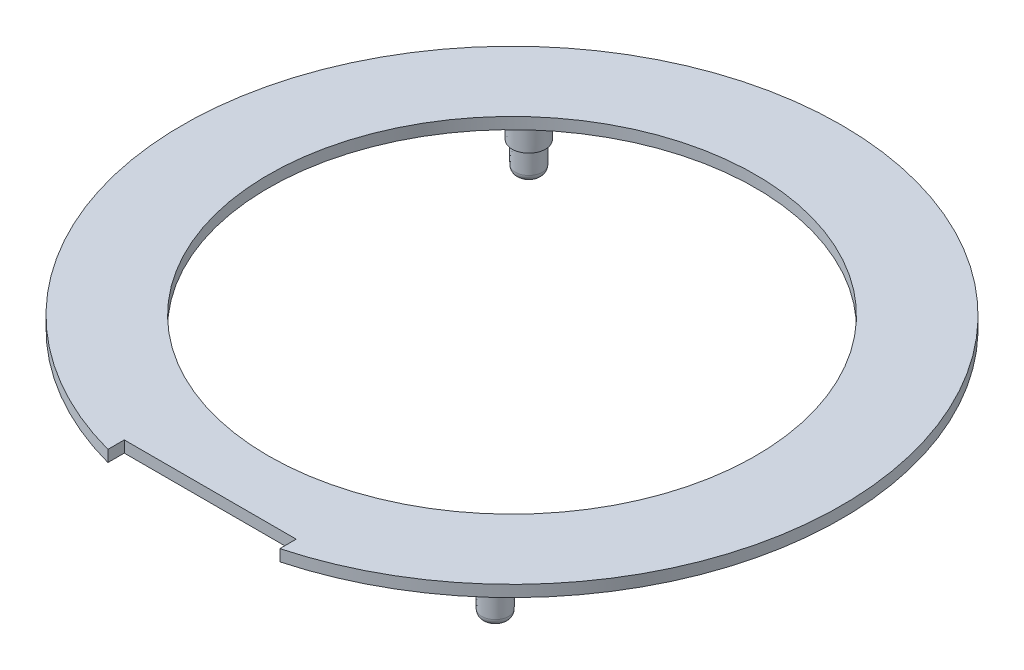
ISO-10303-21;
HEADER;
FILE_DESCRIPTION(('STEP AP214'),'2;1');
FILE_NAME('part.step','',(''),(''),'','','');
FILE_SCHEMA(('AUTOMOTIVE_DESIGN { 1 0 10303 214 1 1 1 1 }'));
ENDSEC;
DATA;
#1=APPLICATION_CONTEXT('core data for automotive mechanical design processes');
#2=APPLICATION_PROTOCOL_DEFINITION('international standard','automotive_design',2000,#1);
#3=PRODUCT_CONTEXT('',#1,'mechanical');
#4=PRODUCT('Part','Part','',(#3));
#5=PRODUCT_RELATED_PRODUCT_CATEGORY('part','',(#4));
#6=PRODUCT_DEFINITION_FORMATION('','',#4);
#7=PRODUCT_DEFINITION_CONTEXT('part definition',#1,'design');
#8=PRODUCT_DEFINITION('design','',#6,#7);
#9=PRODUCT_DEFINITION_SHAPE('','',#8);
#10=(LENGTH_UNIT() NAMED_UNIT(*) SI_UNIT(.MILLI.,.METRE.));
#11=(NAMED_UNIT(*) PLANE_ANGLE_UNIT() SI_UNIT($,.RADIAN.));
#12=(NAMED_UNIT(*) SI_UNIT($,.STERADIAN.) SOLID_ANGLE_UNIT());
#13=UNCERTAINTY_MEASURE_WITH_UNIT(LENGTH_MEASURE(1.E-05),#10,'distance_accuracy_value','');
#14=(GEOMETRIC_REPRESENTATION_CONTEXT(3) GLOBAL_UNCERTAINTY_ASSIGNED_CONTEXT((#13)) GLOBAL_UNIT_ASSIGNED_CONTEXT((#10,
#11,#12)) REPRESENTATION_CONTEXT('',''));
#15=CARTESIAN_POINT('',(0.,0.,0.));
#16=DIRECTION('',(0.,0.,1.));
#17=DIRECTION('',(1.,0.,0.));
#18=AXIS2_PLACEMENT_3D('',#15,#16,#17);
#19=CARTESIAN_POINT('',(0.,0.4,-1.53064501));
#20=DIRECTION('',(0.,1.,0.));
#21=DIRECTION('',(0.,0.,1.));
#22=AXIS2_PLACEMENT_3D('',#19,#20,#21);
#23=PLANE('',#22);
#24=DIRECTION('',(0.,0.,1.));
#25=VECTOR('',#24,1.);
#26=CARTESIAN_POINT('',(-3.,0.4,9.));
#27=LINE('',#26,#25);
#28=CARTESIAN_POINT('',(-3.,0.4,9.));
#29=VERTEX_POINT('',#28);
#30=CARTESIAN_POINT('',(-3.,0.4,9.57115664558726));
#31=VERTEX_POINT('',#30);
#32=EDGE_CURVE('E85',#29,#31,#27,.T.);
#33=ORIENTED_EDGE('',*,*,#32,.F.);
#34=DIRECTION('',(-1.,0.,0.));
#35=VECTOR('',#34,1.);
#36=CARTESIAN_POINT('',(3.,0.4,9.));
#37=LINE('',#36,#35);
#38=CARTESIAN_POINT('',(3.,0.4,9.));
#39=VERTEX_POINT('',#38);
#40=EDGE_CURVE('E93',#39,#29,#37,.T.);
#41=ORIENTED_EDGE('',*,*,#40,.F.);
#42=DIRECTION('',(0.,0.,-1.));
#43=VECTOR('',#42,1.);
#44=CARTESIAN_POINT('',(3.,0.4,9.));
#45=LINE('',#44,#43);
#46=CARTESIAN_POINT('',(3.,0.4,9.57115664558726));
#47=VERTEX_POINT('',#46);
#48=EDGE_CURVE('E78',#47,#39,#45,.T.);
#49=ORIENTED_EDGE('',*,*,#48,.F.);
#50=CARTESIAN_POINT('',(0.,0.4,-1.53064501));
#51=DIRECTION('',(0.,1.,0.));
#52=DIRECTION('',(0.,0.,1.));
#53=AXIS2_PLACEMENT_3D('',#50,#51,#52);
#54=CIRCLE('',#53,11.5);
#55=EDGE_CURVE('E91',#47,#31,#54,.T.);
#56=ORIENTED_EDGE('',*,*,#55,.T.);
#57=EDGE_LOOP('',(#33,#41,#49,#56));
#58=FACE_BOUND('',#57,.T.);
#59=CARTESIAN_POINT('',(0.,0.4,-1.53064501));
#60=DIRECTION('',(0.,1.,0.));
#61=DIRECTION('',(0.,0.,1.));
#62=AXIS2_PLACEMENT_3D('',#59,#60,#61);
#63=CIRCLE('',#62,8.5);
#64=CARTESIAN_POINT('',(0.,0.4,6.96935499));
#65=VERTEX_POINT('',#64);
#66=EDGE_CURVE('E104',#65,#65,#63,.T.);
#67=ORIENTED_EDGE('',*,*,#66,.F.);
#68=EDGE_LOOP('',(#67));
#69=FACE_BOUND('',#68,.T.);
#70=ADVANCED_FACE('F35',(#58,#69),#23,.T.);
#71=CARTESIAN_POINT('',(0.,0.,-1.53064501));
#72=DIRECTION('',(0.,1.,0.));
#73=DIRECTION('',(0.,0.,1.));
#74=AXIS2_PLACEMENT_3D('',#71,#72,#73);
#75=PLANE('',#74);
#76=CARTESIAN_POINT('',(6.41810697234869,0.,5.47348968969626));
#77=DIRECTION('',(0.,1.,0.));
#78=DIRECTION('',(1.,0.,0.));
#79=AXIS2_PLACEMENT_3D('',#76,#77,#78);
#80=CIRCLE('',#79,0.6);
#81=CARTESIAN_POINT('',(7.01810697234869,0.,5.47348968969626));
#82=VERTEX_POINT('',#81);
#83=EDGE_CURVE('E113',#82,#82,#80,.T.);
#84=ORIENTED_EDGE('',*,*,#83,.T.);
#85=EDGE_LOOP('',(#84));
#86=FACE_BOUND('',#85,.T.);
#87=CARTESIAN_POINT('',(7.00413469969619,0.,-7.94875198234876));
#88=DIRECTION('',(0.,1.,0.));
#89=DIRECTION('',(0.,0.,-1.));
#90=AXIS2_PLACEMENT_3D('',#87,#88,#89);
#91=CIRCLE('',#90,0.6);
#92=CARTESIAN_POINT('',(7.00413469969619,0.,-8.54875198234876));
#93=VERTEX_POINT('',#92);
#94=EDGE_CURVE('E112',#93,#93,#91,.T.);
#95=ORIENTED_EDGE('',*,*,#94,.T.);
#96=EDGE_LOOP('',(#95));
#97=FACE_BOUND('',#96,.T.);
#98=CARTESIAN_POINT('',(-6.41810697234874,0.,-8.53477970969621));
#99=DIRECTION('',(0.,1.,0.));
#100=DIRECTION('',(-1.,0.,0.));
#101=AXIS2_PLACEMENT_3D('',#98,#99,#100);
#102=CIRCLE('',#101,0.6);
#103=CARTESIAN_POINT('',(-7.01810697234874,0.,-8.53477970969622));
#104=VERTEX_POINT('',#103);
#105=EDGE_CURVE('E125',#104,#104,#102,.T.);
#106=ORIENTED_EDGE('',*,*,#105,.T.);
#107=EDGE_LOOP('',(#106));
#108=FACE_BOUND('',#107,.T.);
#109=CARTESIAN_POINT('',(-7.00413469969619,0.,4.88746196234876));
#110=DIRECTION('',(0.,1.,0.));
#111=DIRECTION('',(0.,0.,1.));
#112=AXIS2_PLACEMENT_3D('',#109,#110,#111);
#113=CIRCLE('',#112,0.6);
#114=CARTESIAN_POINT('',(-7.00413469969619,0.,5.48746196234876));
#115=VERTEX_POINT('',#114);
#116=EDGE_CURVE('E118',#115,#115,#113,.T.);
#117=ORIENTED_EDGE('',*,*,#116,.T.);
#118=EDGE_LOOP('',(#117));
#119=FACE_BOUND('',#118,.T.);
#120=DIRECTION('',(1.,0.,0.));
#121=VECTOR('',#120,1.);
#122=CARTESIAN_POINT('',(3.,0.,9.));
#123=LINE('',#122,#121);
#124=CARTESIAN_POINT('',(-3.,0.,9.));
#125=VERTEX_POINT('',#124);
#126=CARTESIAN_POINT('',(3.,0.,9.));
#127=VERTEX_POINT('',#126);
#128=EDGE_CURVE('E421',#125,#127,#123,.T.);
#129=ORIENTED_EDGE('',*,*,#128,.F.);
#130=DIRECTION('',(0.,0.,-1.));
#131=VECTOR('',#130,1.);
#132=CARTESIAN_POINT('',(-3.,0.,9.));
#133=LINE('',#132,#131);
#134=CARTESIAN_POINT('',(-3.,0.,9.57115664558726));
#135=VERTEX_POINT('',#134);
#136=EDGE_CURVE('E59',#135,#125,#133,.T.);
#137=ORIENTED_EDGE('',*,*,#136,.F.);
#138=CARTESIAN_POINT('',(0.,0.,-1.53064501));
#139=DIRECTION('',(0.,1.,0.));
#140=DIRECTION('',(0.,0.,1.));
#141=AXIS2_PLACEMENT_3D('',#138,#139,#140);
#142=CIRCLE('',#141,11.5);
#143=CARTESIAN_POINT('',(3.,0.,9.57115664558726));
#144=VERTEX_POINT('',#143);
#145=EDGE_CURVE('E99',#144,#135,#142,.T.);
#146=ORIENTED_EDGE('',*,*,#145,.F.);
#147=DIRECTION('',(0.,0.,1.));
#148=VECTOR('',#147,1.);
#149=CARTESIAN_POINT('',(3.,0.,9.));
#150=LINE('',#149,#148);
#151=EDGE_CURVE('E50',#127,#144,#150,.T.);
#152=ORIENTED_EDGE('',*,*,#151,.F.);
#153=EDGE_LOOP('',(#129,#137,#146,#152));
#154=FACE_BOUND('',#153,.T.);
#155=CARTESIAN_POINT('',(0.,0.,-1.53064501));
#156=DIRECTION('',(0.,1.,0.));
#157=DIRECTION('',(0.,0.,1.));
#158=AXIS2_PLACEMENT_3D('',#155,#156,#157);
#159=CIRCLE('',#158,8.5);
#160=CARTESIAN_POINT('',(0.,0.,6.96935499));
#161=VERTEX_POINT('',#160);
#162=EDGE_CURVE('E107',#161,#161,#159,.T.);
#163=ORIENTED_EDGE('',*,*,#162,.T.);
#164=EDGE_LOOP('',(#163));
#165=FACE_BOUND('',#164,.T.);
#166=ADVANCED_FACE('F170',(#86,#97,#108,#119,#154,#165),#75,.F.);
#167=CARTESIAN_POINT('',(0.,0.4,-1.53064501));
#168=DIRECTION('',(0.,-1.,0.));
#169=DIRECTION('',(0.,0.,-1.));
#170=AXIS2_PLACEMENT_3D('',#167,#168,#169);
#171=CYLINDRICAL_SURFACE('',#170,11.5);
#172=ORIENTED_EDGE('',*,*,#145,.T.);
#173=DIRECTION('',(0.,1.,0.));
#174=VECTOR('',#173,1.);
#175=CARTESIAN_POINT('',(-3.,-6.07779969204628,9.57115664558726));
#176=LINE('',#175,#174);
#177=EDGE_CURVE('E97',#135,#31,#176,.T.);
#178=ORIENTED_EDGE('',*,*,#177,.T.);
#179=ORIENTED_EDGE('',*,*,#55,.F.);
#180=DIRECTION('',(0.,1.,0.));
#181=VECTOR('',#180,1.);
#182=CARTESIAN_POINT('',(3.,-6.07779969204628,9.57115664558726));
#183=LINE('',#182,#181);
#184=EDGE_CURVE('E75',#144,#47,#183,.T.);
#185=ORIENTED_EDGE('',*,*,#184,.F.);
#186=EDGE_LOOP('',(#172,#178,#179,#185));
#187=FACE_BOUND('',#186,.T.);
#188=ADVANCED_FACE('F96',(#187),#171,.T.);
#189=CARTESIAN_POINT('',(0.,0.4,-1.53064501));
#190=DIRECTION('',(0.,-1.,0.));
#191=DIRECTION('',(0.,0.,-1.));
#192=AXIS2_PLACEMENT_3D('',#189,#190,#191);
#193=CYLINDRICAL_SURFACE('',#192,8.5);
#194=ORIENTED_EDGE('',*,*,#66,.T.);
#195=EDGE_LOOP('',(#194));
#196=FACE_BOUND('',#195,.T.);
#197=ORIENTED_EDGE('',*,*,#162,.F.);
#198=EDGE_LOOP('',(#197));
#199=FACE_BOUND('',#198,.T.);
#200=ADVANCED_FACE('F178',(#196,#199),#193,.F.);
#201=CARTESIAN_POINT('',(-7.00413469969619,0.,4.88746196234876));
#202=DIRECTION('',(0.,1.,0.));
#203=DIRECTION('',(0.,0.,-1.));
#204=AXIS2_PLACEMENT_3D('',#201,#202,#203);
#205=CONICAL_SURFACE('',#204,0.6,0.0174532925199433);
#206=CARTESIAN_POINT('',(-7.00413469969619,-1.,4.88746196234876));
#207=DIRECTION('',(0.,1.,0.));
#208=DIRECTION('',(0.,0.,1.));
#209=AXIS2_PLACEMENT_3D('',#206,#207,#208);
#210=CIRCLE('',#209,0.582544935071783);
#211=CARTESIAN_POINT('',(-7.00413469969619,-1.,5.47000689742054));
#212=VERTEX_POINT('',#211);
#213=EDGE_CURVE('E115',#212,#212,#210,.T.);
#214=ORIENTED_EDGE('',*,*,#213,.T.);
#215=EDGE_LOOP('',(#214));
#216=FACE_BOUND('',#215,.T.);
#217=ORIENTED_EDGE('',*,*,#116,.F.);
#218=EDGE_LOOP('',(#217));
#219=FACE_BOUND('',#218,.T.);
#220=ADVANCED_FACE('F213',(#216,#219),#205,.T.);
#221=CARTESIAN_POINT('',(-7.00413469969619,-1.,4.88746196234876));
#222=DIRECTION('',(0.,1.,0.));
#223=DIRECTION('',(0.,0.,1.));
#224=AXIS2_PLACEMENT_3D('',#221,#222,#223);
#225=PLANE('',#224);
#226=CARTESIAN_POINT('',(-7.00413469969619,-1.,4.88746196234876));
#227=DIRECTION('',(0.,1.,0.));
#228=DIRECTION('',(0.,0.,1.));
#229=AXIS2_PLACEMENT_3D('',#226,#227,#228);
#230=CIRCLE('',#229,0.482544935071784);
#231=CARTESIAN_POINT('',(-7.00413469969619,-1.,5.37000689742055));
#232=VERTEX_POINT('',#231);
#233=EDGE_CURVE('E98',#232,#232,#230,.F.);
#234=ORIENTED_EDGE('',*,*,#233,.F.);
#235=EDGE_LOOP('',(#234));
#236=FACE_BOUND('',#235,.T.);
#237=ORIENTED_EDGE('',*,*,#213,.F.);
#238=EDGE_LOOP('',(#237));
#239=FACE_BOUND('',#238,.T.);
#240=ADVANCED_FACE('F216',(#236,#239),#225,.F.);
#241=CARTESIAN_POINT('',(-7.00413469969619,0.,4.88746196234876));
#242=DIRECTION('',(0.,1.,0.));
#243=DIRECTION('',(0.,0.,-1.));
#244=AXIS2_PLACEMENT_3D('',#241,#242,#243);
#245=CONICAL_SURFACE('',#244,0.500000000000002,0.0174532925199433);
#246=CARTESIAN_POINT('',(-7.00413469969619,-1.75436310160932,4.88746196234876));
#247=DIRECTION('',(0.,1.,0.));
#248=DIRECTION('',(0.,0.,1.));
#249=AXIS2_PLACEMENT_3D('',#246,#247,#248);
#250=CIRCLE('',#249,0.469377478153742);
#251=CARTESIAN_POINT('',(-7.00413469969619,-1.75436310160932,5.3568394405025));
#252=VERTEX_POINT('',#251);
#253=EDGE_CURVE('E137',#252,#252,#250,.T.);
#254=ORIENTED_EDGE('',*,*,#253,.T.);
#255=EDGE_LOOP('',(#254));
#256=FACE_BOUND('',#255,.T.);
#257=ORIENTED_EDGE('',*,*,#233,.T.);
#258=EDGE_LOOP('',(#257));
#259=FACE_BOUND('',#258,.T.);
#260=ADVANCED_FACE('F218',(#256,#259),#245,.T.);
#261=CARTESIAN_POINT('',(-7.00413469969619,-2.,4.88746196234876));
#262=DIRECTION('',(0.,-1.,0.));
#263=DIRECTION('',(0.,0.,-1.));
#264=AXIS2_PLACEMENT_3D('',#261,#262,#263);
#265=PLANE('',#264);
#266=CARTESIAN_POINT('',(-7.00413469969619,-2.,4.88746196234876));
#267=DIRECTION('',(0.,-1.,0.));
#268=DIRECTION('',(0.,0.,-1.));
#269=AXIS2_PLACEMENT_3D('',#266,#267,#268);
#270=CIRCLE('',#269,0.219415554364644);
#271=CARTESIAN_POINT('',(-7.00413469969619,-2.,4.66804640798412));
#272=VERTEX_POINT('',#271);
#273=EDGE_CURVE('E134',#272,#272,#270,.T.);
#274=ORIENTED_EDGE('',*,*,#273,.T.);
#275=EDGE_LOOP('',(#274));
#276=FACE_BOUND('',#275,.T.);
#277=ADVANCED_FACE('F207',(#276),#265,.T.);
#278=CARTESIAN_POINT('',(-6.41810697234874,0.,-8.53477970969621));
#279=DIRECTION('',(0.,1.,0.));
#280=DIRECTION('',(0.,0.,-1.));
#281=AXIS2_PLACEMENT_3D('',#278,#279,#280);
#282=CONICAL_SURFACE('',#281,0.6,0.0174532925199433);
#283=CARTESIAN_POINT('',(-6.41810697234874,-1.,-8.53477970969621));
#284=DIRECTION('',(0.,1.,0.));
#285=DIRECTION('',(0.,0.,1.));
#286=AXIS2_PLACEMENT_3D('',#283,#284,#285);
#287=CIRCLE('',#286,0.582544935071783);
#288=CARTESIAN_POINT('',(-6.41810697234874,-1.,-7.95223477462443));
#289=VERTEX_POINT('',#288);
#290=EDGE_CURVE('E122',#289,#289,#287,.T.);
#291=ORIENTED_EDGE('',*,*,#290,.T.);
#292=EDGE_LOOP('',(#291));
#293=FACE_BOUND('',#292,.T.);
#294=ORIENTED_EDGE('',*,*,#105,.F.);
#295=EDGE_LOOP('',(#294));
#296=FACE_BOUND('',#295,.T.);
#297=ADVANCED_FACE('F204',(#293,#296),#282,.T.);
#298=CARTESIAN_POINT('',(-6.41810697234874,-1.,-8.53477970969621));
#299=DIRECTION('',(0.,1.,0.));
#300=DIRECTION('',(-1.,0.,0.));
#301=AXIS2_PLACEMENT_3D('',#298,#299,#300);
#302=PLANE('',#301);
#303=CARTESIAN_POINT('',(-6.41810697234874,-1.,-8.53477970969621));
#304=DIRECTION('',(0.,1.,0.));
#305=DIRECTION('',(0.,0.,1.));
#306=AXIS2_PLACEMENT_3D('',#303,#304,#305);
#307=CIRCLE('',#306,0.482544935071784);
#308=CARTESIAN_POINT('',(-6.41810697234874,-1.,-8.05223477462443));
#309=VERTEX_POINT('',#308);
#310=EDGE_CURVE('E102',#309,#309,#307,.F.);
#311=ORIENTED_EDGE('',*,*,#310,.F.);
#312=EDGE_LOOP('',(#311));
#313=FACE_BOUND('',#312,.T.);
#314=ORIENTED_EDGE('',*,*,#290,.F.);
#315=EDGE_LOOP('',(#314));
#316=FACE_BOUND('',#315,.T.);
#317=ADVANCED_FACE('F198',(#313,#316),#302,.F.);
#318=CARTESIAN_POINT('',(7.00413469969619,0.,-7.94875198234876));
#319=DIRECTION('',(0.,1.,0.));
#320=DIRECTION('',(0.,0.,-1.));
#321=AXIS2_PLACEMENT_3D('',#318,#319,#320);
#322=CONICAL_SURFACE('',#321,0.6,0.0174532925199433);
#323=CARTESIAN_POINT('',(7.00413469969619,-1.,-7.94875198234876));
#324=DIRECTION('',(0.,1.,0.));
#325=DIRECTION('',(0.,0.,1.));
#326=AXIS2_PLACEMENT_3D('',#323,#324,#325);
#327=CIRCLE('',#326,0.582544935071783);
#328=CARTESIAN_POINT('',(7.00413469969619,-1.,-7.36620704727698));
#329=VERTEX_POINT('',#328);
#330=EDGE_CURVE('E129',#329,#329,#327,.T.);
#331=ORIENTED_EDGE('',*,*,#330,.T.);
#332=EDGE_LOOP('',(#331));
#333=FACE_BOUND('',#332,.T.);
#334=ORIENTED_EDGE('',*,*,#94,.F.);
#335=EDGE_LOOP('',(#334));
#336=FACE_BOUND('',#335,.T.);
#337=ADVANCED_FACE('F195',(#333,#336),#322,.T.);
#338=CARTESIAN_POINT('',(7.00413469969619,-1.,-7.94875198234876));
#339=DIRECTION('',(0.,1.,0.));
#340=DIRECTION('',(0.,0.,-1.));
#341=AXIS2_PLACEMENT_3D('',#338,#339,#340);
#342=PLANE('',#341);
#343=CARTESIAN_POINT('',(7.00413469969619,-1.,-7.94875198234876));
#344=DIRECTION('',(0.,1.,0.));
#345=DIRECTION('',(0.,0.,1.));
#346=AXIS2_PLACEMENT_3D('',#343,#344,#345);
#347=CIRCLE('',#346,0.482544935071784);
#348=CARTESIAN_POINT('',(7.00413469969619,-1.,-7.46620704727698));
#349=VERTEX_POINT('',#348);
#350=EDGE_CURVE('E121',#349,#349,#347,.F.);
#351=ORIENTED_EDGE('',*,*,#350,.F.);
#352=EDGE_LOOP('',(#351));
#353=FACE_BOUND('',#352,.T.);
#354=ORIENTED_EDGE('',*,*,#330,.F.);
#355=EDGE_LOOP('',(#354));
#356=FACE_BOUND('',#355,.T.);
#357=ADVANCED_FACE('F187',(#353,#356),#342,.F.);
#358=CARTESIAN_POINT('',(6.41810697234869,0.,5.47348968969626));
#359=DIRECTION('',(0.,1.,0.));
#360=DIRECTION('',(0.,0.,-1.));
#361=AXIS2_PLACEMENT_3D('',#358,#359,#360);
#362=CONICAL_SURFACE('',#361,0.6,0.0174532925199433);
#363=CARTESIAN_POINT('',(6.41810697234869,-1.,5.47348968969626));
#364=DIRECTION('',(0.,1.,0.));
#365=DIRECTION('',(0.,0.,1.));
#366=AXIS2_PLACEMENT_3D('',#363,#364,#365);
#367=CIRCLE('',#366,0.582544935071783);
#368=CARTESIAN_POINT('',(6.41810697234869,-1.,6.05603462476804));
#369=VERTEX_POINT('',#368);
#370=EDGE_CURVE('E110',#369,#369,#367,.T.);
#371=ORIENTED_EDGE('',*,*,#370,.T.);
#372=EDGE_LOOP('',(#371));
#373=FACE_BOUND('',#372,.T.);
#374=ORIENTED_EDGE('',*,*,#83,.F.);
#375=EDGE_LOOP('',(#374));
#376=FACE_BOUND('',#375,.T.);
#377=ADVANCED_FACE('F183',(#373,#376),#362,.T.);
#378=CARTESIAN_POINT('',(6.41810697234869,-1.,5.47348968969626));
#379=DIRECTION('',(0.,1.,0.));
#380=DIRECTION('',(1.,0.,0.));
#381=AXIS2_PLACEMENT_3D('',#378,#379,#380);
#382=PLANE('',#381);
#383=CARTESIAN_POINT('',(6.41810697234869,-1.,5.47348968969626));
#384=DIRECTION('',(0.,1.,0.));
#385=DIRECTION('',(0.,0.,1.));
#386=AXIS2_PLACEMENT_3D('',#383,#384,#385);
#387=CIRCLE('',#386,0.482544935071784);
#388=CARTESIAN_POINT('',(6.41810697234869,-1.,5.95603462476804));
#389=VERTEX_POINT('',#388);
#390=EDGE_CURVE('E128',#389,#389,#387,.F.);
#391=ORIENTED_EDGE('',*,*,#390,.F.);
#392=EDGE_LOOP('',(#391));
#393=FACE_BOUND('',#392,.T.);
#394=ORIENTED_EDGE('',*,*,#370,.F.);
#395=EDGE_LOOP('',(#394));
#396=FACE_BOUND('',#395,.T.);
#397=ADVANCED_FACE('F186',(#393,#396),#382,.F.);
#398=CARTESIAN_POINT('',(-6.41810697234874,0.,-8.53477970969621));
#399=DIRECTION('',(0.,1.,0.));
#400=DIRECTION('',(0.,0.,-1.));
#401=AXIS2_PLACEMENT_3D('',#398,#399,#400);
#402=CONICAL_SURFACE('',#401,0.500000000000002,0.0174532925199433);
#403=CARTESIAN_POINT('',(-6.41810697234874,-1.75436310160932,-8.53477970969621));
#404=DIRECTION('',(0.,1.,0.));
#405=DIRECTION('',(0.,0.,1.));
#406=AXIS2_PLACEMENT_3D('',#403,#404,#405);
#407=CIRCLE('',#406,0.469377478153742);
#408=CARTESIAN_POINT('',(-6.41810697234874,-1.75436310160932,-8.06540223154247));
#409=VERTEX_POINT('',#408);
#410=EDGE_CURVE('E11',#409,#409,#407,.T.);
#411=ORIENTED_EDGE('',*,*,#410,.T.);
#412=EDGE_LOOP('',(#411));
#413=FACE_BOUND('',#412,.T.);
#414=ORIENTED_EDGE('',*,*,#310,.T.);
#415=EDGE_LOOP('',(#414));
#416=FACE_BOUND('',#415,.T.);
#417=ADVANCED_FACE('F209',(#413,#416),#402,.T.);
#418=CARTESIAN_POINT('',(-6.41810697234874,-2.,-8.53477970969621));
#419=DIRECTION('',(0.,-1.,0.));
#420=DIRECTION('',(1.,0.,0.));
#421=AXIS2_PLACEMENT_3D('',#418,#419,#420);
#422=PLANE('',#421);
#423=CARTESIAN_POINT('',(-6.41810697234874,-2.,-8.53477970969621));
#424=DIRECTION('',(0.,-1.,0.));
#425=DIRECTION('',(0.,0.,-1.));
#426=AXIS2_PLACEMENT_3D('',#423,#424,#425);
#427=CIRCLE('',#426,0.219415554364644);
#428=CARTESIAN_POINT('',(-6.41810697234874,-2.,-8.75419526406086));
#429=VERTEX_POINT('',#428);
#430=EDGE_CURVE('E43',#429,#429,#427,.T.);
#431=ORIENTED_EDGE('',*,*,#430,.T.);
#432=EDGE_LOOP('',(#431));
#433=FACE_BOUND('',#432,.T.);
#434=ADVANCED_FACE('F154',(#433),#422,.T.);
#435=CARTESIAN_POINT('',(7.00413469969619,0.,-7.94875198234876));
#436=DIRECTION('',(0.,1.,0.));
#437=DIRECTION('',(0.,0.,-1.));
#438=AXIS2_PLACEMENT_3D('',#435,#436,#437);
#439=CONICAL_SURFACE('',#438,0.500000000000002,0.0174532925199433);
#440=CARTESIAN_POINT('',(7.00413469969619,-1.75436310160932,-7.94875198234876));
#441=DIRECTION('',(0.,1.,0.));
#442=DIRECTION('',(0.,0.,1.));
#443=AXIS2_PLACEMENT_3D('',#440,#441,#442);
#444=CIRCLE('',#443,0.469377478153742);
#445=CARTESIAN_POINT('',(7.00413469969619,-1.75436310160932,-7.47937450419502));
#446=VERTEX_POINT('',#445);
#447=EDGE_CURVE('E143',#446,#446,#444,.T.);
#448=ORIENTED_EDGE('',*,*,#447,.T.);
#449=EDGE_LOOP('',(#448));
#450=FACE_BOUND('',#449,.T.);
#451=ORIENTED_EDGE('',*,*,#350,.T.);
#452=EDGE_LOOP('',(#451));
#453=FACE_BOUND('',#452,.T.);
#454=ADVANCED_FACE('F200',(#450,#453),#439,.T.);
#455=CARTESIAN_POINT('',(7.00413469969619,-2.,-7.94875198234876));
#456=DIRECTION('',(0.,-1.,0.));
#457=DIRECTION('',(0.,0.,1.));
#458=AXIS2_PLACEMENT_3D('',#455,#456,#457);
#459=PLANE('',#458);
#460=CARTESIAN_POINT('',(7.00413469969619,-2.,-7.94875198234876));
#461=DIRECTION('',(0.,-1.,0.));
#462=DIRECTION('',(0.,0.,-1.));
#463=AXIS2_PLACEMENT_3D('',#460,#461,#462);
#464=CIRCLE('',#463,0.219415554364644);
#465=CARTESIAN_POINT('',(7.00413469969619,-2.,-8.1681675367134));
#466=VERTEX_POINT('',#465);
#467=EDGE_CURVE('E140',#466,#466,#464,.T.);
#468=ORIENTED_EDGE('',*,*,#467,.T.);
#469=EDGE_LOOP('',(#468));
#470=FACE_BOUND('',#469,.T.);
#471=ADVANCED_FACE('F193',(#470),#459,.T.);
#472=CARTESIAN_POINT('',(6.41810697234869,0.,5.47348968969626));
#473=DIRECTION('',(0.,1.,0.));
#474=DIRECTION('',(0.,0.,-1.));
#475=AXIS2_PLACEMENT_3D('',#472,#473,#474);
#476=CONICAL_SURFACE('',#475,0.500000000000002,0.0174532925199433);
#477=CARTESIAN_POINT('',(6.41810697234869,-1.75436310160932,5.47348968969626));
#478=DIRECTION('',(0.,1.,0.));
#479=DIRECTION('',(0.,0.,1.));
#480=AXIS2_PLACEMENT_3D('',#477,#478,#479);
#481=CIRCLE('',#480,0.469377478153742);
#482=CARTESIAN_POINT('',(6.41810697234869,-1.75436310160932,5.94286716785));
#483=VERTEX_POINT('',#482);
#484=EDGE_CURVE('E149',#483,#483,#481,.T.);
#485=ORIENTED_EDGE('',*,*,#484,.T.);
#486=EDGE_LOOP('',(#485));
#487=FACE_BOUND('',#486,.T.);
#488=ORIENTED_EDGE('',*,*,#390,.T.);
#489=EDGE_LOOP('',(#488));
#490=FACE_BOUND('',#489,.T.);
#491=ADVANCED_FACE('F189',(#487,#490),#476,.T.);
#492=CARTESIAN_POINT('',(6.41810697234869,-2.,5.47348968969626));
#493=DIRECTION('',(0.,-1.,0.));
#494=DIRECTION('',(-1.,0.,0.));
#495=AXIS2_PLACEMENT_3D('',#492,#493,#494);
#496=PLANE('',#495);
#497=CARTESIAN_POINT('',(6.41810697234869,-2.,5.47348968969626));
#498=DIRECTION('',(0.,-1.,0.));
#499=DIRECTION('',(0.,0.,-1.));
#500=AXIS2_PLACEMENT_3D('',#497,#498,#499);
#501=CIRCLE('',#500,0.219415554364644);
#502=CARTESIAN_POINT('',(6.41810697234869,-2.,5.25407413533161));
#503=VERTEX_POINT('',#502);
#504=EDGE_CURVE('E146',#503,#503,#501,.T.);
#505=ORIENTED_EDGE('',*,*,#504,.T.);
#506=EDGE_LOOP('',(#505));
#507=FACE_BOUND('',#506,.T.);
#508=ADVANCED_FACE('F192',(#507),#496,.T.);
#509=CARTESIAN_POINT('',(-7.00413469969619,-1.75,4.88746196234876));
#510=DIRECTION('',(0.,-1.,0.));
#511=DIRECTION('',(0.,0.,-1.));
#512=AXIS2_PLACEMENT_3D('',#509,#510,#511);
#513=DEGENERATE_TOROIDAL_SURFACE('',#512,0.219415554364644,0.25,.T.);
#514=ORIENTED_EDGE('',*,*,#253,.F.);
#515=EDGE_LOOP('',(#514));
#516=FACE_BOUND('',#515,.T.);
#517=ORIENTED_EDGE('',*,*,#273,.F.);
#518=EDGE_LOOP('',(#517));
#519=FACE_BOUND('',#518,.T.);
#520=ADVANCED_FACE('F222',(#516,#519),#513,.T.);
#521=CARTESIAN_POINT('',(7.00413469969619,-1.75,-7.94875198234876));
#522=DIRECTION('',(0.,-1.,0.));
#523=DIRECTION('',(0.,0.,-1.));
#524=AXIS2_PLACEMENT_3D('',#521,#522,#523);
#525=DEGENERATE_TOROIDAL_SURFACE('',#524,0.219415554364644,0.25,.T.);
#526=ORIENTED_EDGE('',*,*,#447,.F.);
#527=EDGE_LOOP('',(#526));
#528=FACE_BOUND('',#527,.T.);
#529=ORIENTED_EDGE('',*,*,#467,.F.);
#530=EDGE_LOOP('',(#529));
#531=FACE_BOUND('',#530,.T.);
#532=ADVANCED_FACE('F166',(#528,#531),#525,.T.);
#533=CARTESIAN_POINT('',(6.41810697234869,-1.75,5.47348968969626));
#534=DIRECTION('',(0.,-1.,0.));
#535=DIRECTION('',(0.,0.,-1.));
#536=AXIS2_PLACEMENT_3D('',#533,#534,#535);
#537=DEGENERATE_TOROIDAL_SURFACE('',#536,0.219415554364644,0.25,.T.);
#538=ORIENTED_EDGE('',*,*,#484,.F.);
#539=EDGE_LOOP('',(#538));
#540=FACE_BOUND('',#539,.T.);
#541=ORIENTED_EDGE('',*,*,#504,.F.);
#542=EDGE_LOOP('',(#541));
#543=FACE_BOUND('',#542,.T.);
#544=ADVANCED_FACE('F158',(#540,#543),#537,.T.);
#545=CARTESIAN_POINT('',(-6.41810697234874,-1.75,-8.53477970969621));
#546=DIRECTION('',(0.,-1.,0.));
#547=DIRECTION('',(0.,0.,-1.));
#548=AXIS2_PLACEMENT_3D('',#545,#546,#547);
#549=DEGENERATE_TOROIDAL_SURFACE('',#548,0.219415554364644,0.25,.T.);
#550=ORIENTED_EDGE('',*,*,#410,.F.);
#551=EDGE_LOOP('',(#550));
#552=FACE_BOUND('',#551,.T.);
#553=ORIENTED_EDGE('',*,*,#430,.F.);
#554=EDGE_LOOP('',(#553));
#555=FACE_BOUND('',#554,.T.);
#556=ADVANCED_FACE('F37',(#552,#555),#549,.T.);
#557=CARTESIAN_POINT('',(-3.,-6.07779969204628,9.));
#558=DIRECTION('',(-1.,0.,0.));
#559=DIRECTION('',(0.,0.,1.));
#560=AXIS2_PLACEMENT_3D('',#557,#558,#559);
#561=PLANE('',#560);
#562=ORIENTED_EDGE('',*,*,#136,.T.);
#563=DIRECTION('',(0.,1.,0.));
#564=VECTOR('',#563,1.);
#565=CARTESIAN_POINT('',(-3.,-6.07779969204628,9.));
#566=LINE('',#565,#564);
#567=EDGE_CURVE('E422',#125,#29,#566,.T.);
#568=ORIENTED_EDGE('',*,*,#567,.T.);
#569=ORIENTED_EDGE('',*,*,#32,.T.);
#570=ORIENTED_EDGE('',*,*,#177,.F.);
#571=EDGE_LOOP('',(#562,#568,#569,#570));
#572=FACE_BOUND('',#571,.T.);
#573=ADVANCED_FACE('F157',(#572),#561,.F.);
#574=CARTESIAN_POINT('',(3.,-6.07779969204628,9.));
#575=DIRECTION('',(0.,0.,-1.));
#576=DIRECTION('',(-1.,0.,0.));
#577=AXIS2_PLACEMENT_3D('',#574,#575,#576);
#578=PLANE('',#577);
#579=ORIENTED_EDGE('',*,*,#128,.T.);
#580=DIRECTION('',(0.,1.,0.));
#581=VECTOR('',#580,1.);
#582=CARTESIAN_POINT('',(3.,-6.07779969204628,9.));
#583=LINE('',#582,#581);
#584=EDGE_CURVE('E84',#127,#39,#583,.T.);
#585=ORIENTED_EDGE('',*,*,#584,.T.);
#586=ORIENTED_EDGE('',*,*,#40,.T.);
#587=ORIENTED_EDGE('',*,*,#567,.F.);
#588=EDGE_LOOP('',(#579,#585,#586,#587));
#589=FACE_BOUND('',#588,.T.);
#590=ADVANCED_FACE('F164',(#589),#578,.F.);
#591=CARTESIAN_POINT('',(3.,-6.07779969204628,9.));
#592=DIRECTION('',(1.,0.,0.));
#593=DIRECTION('',(0.,0.,-1.));
#594=AXIS2_PLACEMENT_3D('',#591,#592,#593);
#595=PLANE('',#594);
#596=ORIENTED_EDGE('',*,*,#151,.T.);
#597=ORIENTED_EDGE('',*,*,#184,.T.);
#598=ORIENTED_EDGE('',*,*,#48,.T.);
#599=ORIENTED_EDGE('',*,*,#584,.F.);
#600=EDGE_LOOP('',(#596,#597,#598,#599));
#601=FACE_BOUND('',#600,.T.);
#602=ADVANCED_FACE('F77',(#601),#595,.F.);
#603=CLOSED_SHELL('',(#70,#166,#188,#200,#220,#240,#260,#277,#297,#317,#337,#357,#377,#397,#417,
#434,#454,#471,#491,#508,#520,#532,#544,#556,#573,#590,#602));
#604=MANIFOLD_SOLID_BREP('B2',#603);
#605=ADVANCED_BREP_SHAPE_REPRESENTATION('',(#18,#604),#14);
#606=SHAPE_DEFINITION_REPRESENTATION(#9,#605);
ENDSEC;
END-ISO-10303-21;
